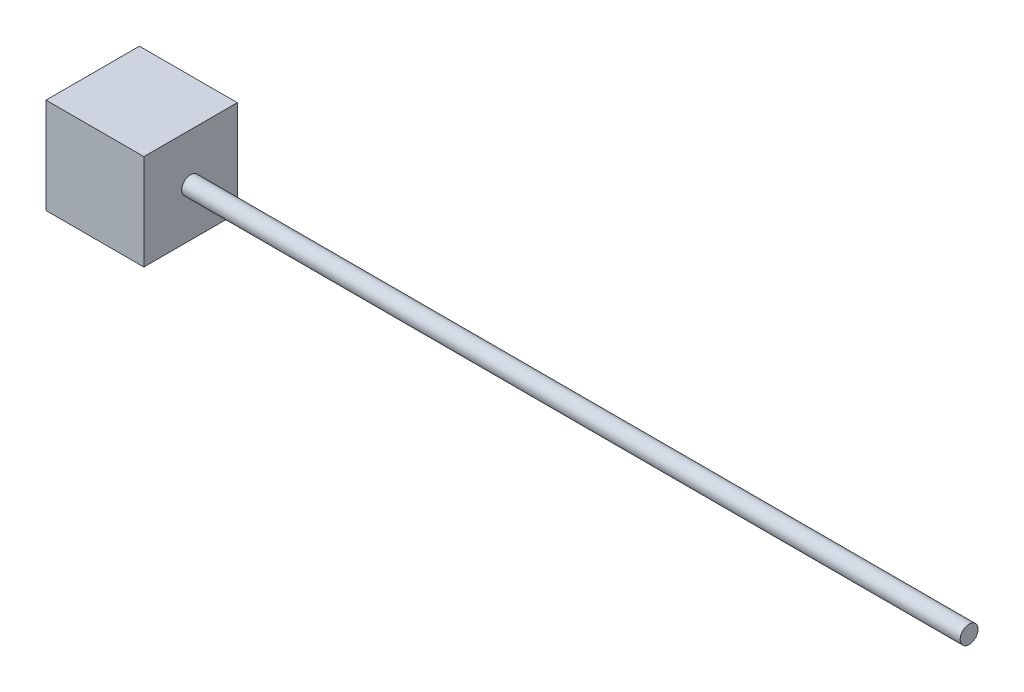
ISO-10303-21;
HEADER;
FILE_DESCRIPTION(('STEP AP214'),'2;1');
FILE_NAME('part.step','',(''),(''),'','','');
FILE_SCHEMA(('AUTOMOTIVE_DESIGN { 1 0 10303 214 1 1 1 1 }'));
ENDSEC;
DATA;
#1=APPLICATION_CONTEXT('core data for automotive mechanical design processes');
#2=APPLICATION_PROTOCOL_DEFINITION('international standard','automotive_design',2000,#1);
#3=PRODUCT_CONTEXT('',#1,'mechanical');
#4=PRODUCT('Part','Part','',(#3));
#5=PRODUCT_RELATED_PRODUCT_CATEGORY('part','',(#4));
#6=PRODUCT_DEFINITION_FORMATION('','',#4);
#7=PRODUCT_DEFINITION_CONTEXT('part definition',#1,'design');
#8=PRODUCT_DEFINITION('design','',#6,#7);
#9=PRODUCT_DEFINITION_SHAPE('','',#8);
#10=(LENGTH_UNIT() NAMED_UNIT(*) SI_UNIT(.MILLI.,.METRE.));
#11=(NAMED_UNIT(*) PLANE_ANGLE_UNIT() SI_UNIT($,.RADIAN.));
#12=(NAMED_UNIT(*) SI_UNIT($,.STERADIAN.) SOLID_ANGLE_UNIT());
#13=UNCERTAINTY_MEASURE_WITH_UNIT(LENGTH_MEASURE(1.E-05),#10,'distance_accuracy_value','');
#14=(GEOMETRIC_REPRESENTATION_CONTEXT(3) GLOBAL_UNCERTAINTY_ASSIGNED_CONTEXT((#13)) GLOBAL_UNIT_ASSIGNED_CONTEXT((#10,
#11,#12)) REPRESENTATION_CONTEXT('',''));
#15=CARTESIAN_POINT('',(0.,0.,0.));
#16=DIRECTION('',(0.,0.,1.));
#17=DIRECTION('',(1.,0.,0.));
#18=AXIS2_PLACEMENT_3D('',#15,#16,#17);
#19=CARTESIAN_POINT('',(22.,21.5,-21.));
#20=DIRECTION('',(-1.,0.,0.));
#21=DIRECTION('',(0.,0.,1.));
#22=AXIS2_PLACEMENT_3D('',#19,#20,#21);
#23=PLANE('',#22);
#24=CARTESIAN_POINT('',(22.,0.,0.));
#25=DIRECTION('',(-1.,0.,0.));
#26=DIRECTION('',(0.,0.,1.));
#27=AXIS2_PLACEMENT_3D('',#24,#25,#26);
#28=CIRCLE('',#27,4.);
#29=CARTESIAN_POINT('',(22.,0.,4.));
#30=VERTEX_POINT('',#29);
#31=EDGE_CURVE('E11',#30,#30,#28,.F.);
#32=ORIENTED_EDGE('',*,*,#31,.F.);
#33=EDGE_LOOP('',(#32));
#34=FACE_BOUND('',#33,.T.);
#35=DIRECTION('',(0.,0.,-1.));
#36=VECTOR('',#35,1.);
#37=CARTESIAN_POINT('',(22.,-21.5,-21.));
#38=LINE('',#37,#36);
#39=CARTESIAN_POINT('',(22.,-21.5,21.));
#40=VERTEX_POINT('',#39);
#41=CARTESIAN_POINT('',(22.,-21.5,-21.));
#42=VERTEX_POINT('',#41);
#43=EDGE_CURVE('E116',#40,#42,#38,.T.);
#44=ORIENTED_EDGE('',*,*,#43,.T.);
#45=DIRECTION('',(0.,-1.,0.));
#46=VECTOR('',#45,1.);
#47=CARTESIAN_POINT('',(22.,21.5,-21.));
#48=LINE('',#47,#46);
#49=CARTESIAN_POINT('',(22.,21.5,-21.));
#50=VERTEX_POINT('',#49);
#51=EDGE_CURVE('E54',#50,#42,#48,.T.);
#52=ORIENTED_EDGE('',*,*,#51,.F.);
#53=DIRECTION('',(0.,0.,-1.));
#54=VECTOR('',#53,1.);
#55=CARTESIAN_POINT('',(22.,21.5,-21.));
#56=LINE('',#55,#54);
#57=CARTESIAN_POINT('',(22.,21.5,21.));
#58=VERTEX_POINT('',#57);
#59=EDGE_CURVE('E98',#58,#50,#56,.T.);
#60=ORIENTED_EDGE('',*,*,#59,.F.);
#61=DIRECTION('',(0.,-1.,0.));
#62=VECTOR('',#61,1.);
#63=CARTESIAN_POINT('',(22.,21.5,21.));
#64=LINE('',#63,#62);
#65=EDGE_CURVE('E112',#58,#40,#64,.T.);
#66=ORIENTED_EDGE('',*,*,#65,.T.);
#67=EDGE_LOOP('',(#44,#52,#60,#66));
#68=FACE_BOUND('',#67,.T.);
#69=ADVANCED_FACE('F45',(#34,#68),#23,.F.);
#70=CARTESIAN_POINT('',(-22.,21.5,-21.));
#71=DIRECTION('',(0.,0.,1.));
#72=DIRECTION('',(1.,0.,0.));
#73=AXIS2_PLACEMENT_3D('',#70,#71,#72);
#74=PLANE('',#73);
#75=DIRECTION('',(-1.,0.,0.));
#76=VECTOR('',#75,1.);
#77=CARTESIAN_POINT('',(-22.,-21.5,-21.));
#78=LINE('',#77,#76);
#79=CARTESIAN_POINT('',(-22.,-21.5,-21.));
#80=VERTEX_POINT('',#79);
#81=EDGE_CURVE('E104',#42,#80,#78,.T.);
#82=ORIENTED_EDGE('',*,*,#81,.T.);
#83=DIRECTION('',(0.,-1.,0.));
#84=VECTOR('',#83,1.);
#85=CARTESIAN_POINT('',(-22.,21.5,-21.));
#86=LINE('',#85,#84);
#87=CARTESIAN_POINT('',(-22.,21.5,-21.));
#88=VERTEX_POINT('',#87);
#89=EDGE_CURVE('E102',#88,#80,#86,.T.);
#90=ORIENTED_EDGE('',*,*,#89,.F.);
#91=DIRECTION('',(-1.,0.,0.));
#92=VECTOR('',#91,1.);
#93=CARTESIAN_POINT('',(-22.,21.5,-21.));
#94=LINE('',#93,#92);
#95=EDGE_CURVE('E93',#50,#88,#94,.T.);
#96=ORIENTED_EDGE('',*,*,#95,.F.);
#97=ORIENTED_EDGE('',*,*,#51,.T.);
#98=EDGE_LOOP('',(#82,#90,#96,#97));
#99=FACE_BOUND('',#98,.T.);
#100=ADVANCED_FACE('F103',(#99),#74,.F.);
#101=CARTESIAN_POINT('',(-22.,21.5,-21.));
#102=DIRECTION('',(1.,0.,0.));
#103=DIRECTION('',(0.,0.,-1.));
#104=AXIS2_PLACEMENT_3D('',#101,#102,#103);
#105=PLANE('',#104);
#106=DIRECTION('',(0.,0.,1.));
#107=VECTOR('',#106,1.);
#108=CARTESIAN_POINT('',(-22.,-21.5,-21.));
#109=LINE('',#108,#107);
#110=CARTESIAN_POINT('',(-22.,-21.5,21.));
#111=VERTEX_POINT('',#110);
#112=EDGE_CURVE('E79',#80,#111,#109,.T.);
#113=ORIENTED_EDGE('',*,*,#112,.T.);
#114=DIRECTION('',(0.,-1.,0.));
#115=VECTOR('',#114,1.);
#116=CARTESIAN_POINT('',(-22.,21.5,21.));
#117=LINE('',#116,#115);
#118=CARTESIAN_POINT('',(-22.,21.5,21.));
#119=VERTEX_POINT('',#118);
#120=EDGE_CURVE('E106',#119,#111,#117,.T.);
#121=ORIENTED_EDGE('',*,*,#120,.F.);
#122=DIRECTION('',(0.,0.,1.));
#123=VECTOR('',#122,1.);
#124=CARTESIAN_POINT('',(-22.,21.5,-21.));
#125=LINE('',#124,#123);
#126=EDGE_CURVE('E96',#88,#119,#125,.T.);
#127=ORIENTED_EDGE('',*,*,#126,.F.);
#128=ORIENTED_EDGE('',*,*,#89,.T.);
#129=EDGE_LOOP('',(#113,#121,#127,#128));
#130=FACE_BOUND('',#129,.T.);
#131=ADVANCED_FACE('F108',(#130),#105,.F.);
#132=CARTESIAN_POINT('',(-22.,21.5,21.));
#133=DIRECTION('',(0.,0.,-1.));
#134=DIRECTION('',(-1.,0.,0.));
#135=AXIS2_PLACEMENT_3D('',#132,#133,#134);
#136=PLANE('',#135);
#137=DIRECTION('',(1.,0.,0.));
#138=VECTOR('',#137,1.);
#139=CARTESIAN_POINT('',(-22.,-21.5,21.));
#140=LINE('',#139,#138);
#141=EDGE_CURVE('E85',#111,#40,#140,.T.);
#142=ORIENTED_EDGE('',*,*,#141,.T.);
#143=ORIENTED_EDGE('',*,*,#65,.F.);
#144=DIRECTION('',(1.,0.,0.));
#145=VECTOR('',#144,1.);
#146=CARTESIAN_POINT('',(-22.,21.5,21.));
#147=LINE('',#146,#145);
#148=EDGE_CURVE('E62',#119,#58,#147,.T.);
#149=ORIENTED_EDGE('',*,*,#148,.F.);
#150=ORIENTED_EDGE('',*,*,#120,.T.);
#151=EDGE_LOOP('',(#142,#143,#149,#150));
#152=FACE_BOUND('',#151,.T.);
#153=ADVANCED_FACE('F146',(#152),#136,.F.);
#154=CARTESIAN_POINT('',(0.,21.5,0.));
#155=DIRECTION('',(0.,1.,0.));
#156=DIRECTION('',(0.,0.,1.));
#157=AXIS2_PLACEMENT_3D('',#154,#155,#156);
#158=PLANE('',#157);
#159=ORIENTED_EDGE('',*,*,#59,.T.);
#160=ORIENTED_EDGE('',*,*,#95,.T.);
#161=ORIENTED_EDGE('',*,*,#126,.T.);
#162=ORIENTED_EDGE('',*,*,#148,.T.);
#163=EDGE_LOOP('',(#159,#160,#161,#162));
#164=FACE_BOUND('',#163,.T.);
#165=ADVANCED_FACE('F94',(#164),#158,.T.);
#166=CARTESIAN_POINT('',(0.,-21.5,0.));
#167=DIRECTION('',(0.,1.,0.));
#168=DIRECTION('',(0.,0.,1.));
#169=AXIS2_PLACEMENT_3D('',#166,#167,#168);
#170=PLANE('',#169);
#171=ORIENTED_EDGE('',*,*,#43,.F.);
#172=ORIENTED_EDGE('',*,*,#141,.F.);
#173=ORIENTED_EDGE('',*,*,#112,.F.);
#174=ORIENTED_EDGE('',*,*,#81,.F.);
#175=EDGE_LOOP('',(#171,#172,#173,#174));
#176=FACE_BOUND('',#175,.T.);
#177=ADVANCED_FACE('F134',(#176),#170,.F.);
#178=CARTESIAN_POINT('',(372.,0.,0.));
#179=DIRECTION('',(-1.,0.,0.));
#180=DIRECTION('',(0.,0.,1.));
#181=AXIS2_PLACEMENT_3D('',#178,#179,#180);
#182=CYLINDRICAL_SURFACE('',#181,4.);
#183=CARTESIAN_POINT('',(372.,0.,0.));
#184=DIRECTION('',(1.,0.,0.));
#185=DIRECTION('',(0.,0.,-1.));
#186=AXIS2_PLACEMENT_3D('',#183,#184,#185);
#187=CIRCLE('',#186,4.);
#188=CARTESIAN_POINT('',(372.,0.,-4.00000000000003));
#189=VERTEX_POINT('',#188);
#190=EDGE_CURVE('E120',#189,#189,#187,.T.);
#191=ORIENTED_EDGE('',*,*,#190,.F.);
#192=EDGE_LOOP('',(#191));
#193=FACE_BOUND('',#192,.T.);
#194=ORIENTED_EDGE('',*,*,#31,.T.);
#195=EDGE_LOOP('',(#194));
#196=FACE_BOUND('',#195,.T.);
#197=ADVANCED_FACE('F136',(#193,#196),#182,.T.);
#198=CARTESIAN_POINT('',(372.,0.,0.));
#199=DIRECTION('',(1.,0.,0.));
#200=DIRECTION('',(0.,0.,-1.));
#201=AXIS2_PLACEMENT_3D('',#198,#199,#200);
#202=PLANE('',#201);
#203=ORIENTED_EDGE('',*,*,#190,.T.);
#204=EDGE_LOOP('',(#203));
#205=FACE_BOUND('',#204,.T.);
#206=ADVANCED_FACE('F143',(#205),#202,.T.);
#207=CLOSED_SHELL('',(#69,#100,#131,#153,#165,#177,#197,#206));
#208=MANIFOLD_SOLID_BREP('B2',#207);
#209=ADVANCED_BREP_SHAPE_REPRESENTATION('',(#18,#208),#14);
#210=SHAPE_DEFINITION_REPRESENTATION(#9,#209);
ENDSEC;
END-ISO-10303-21;
